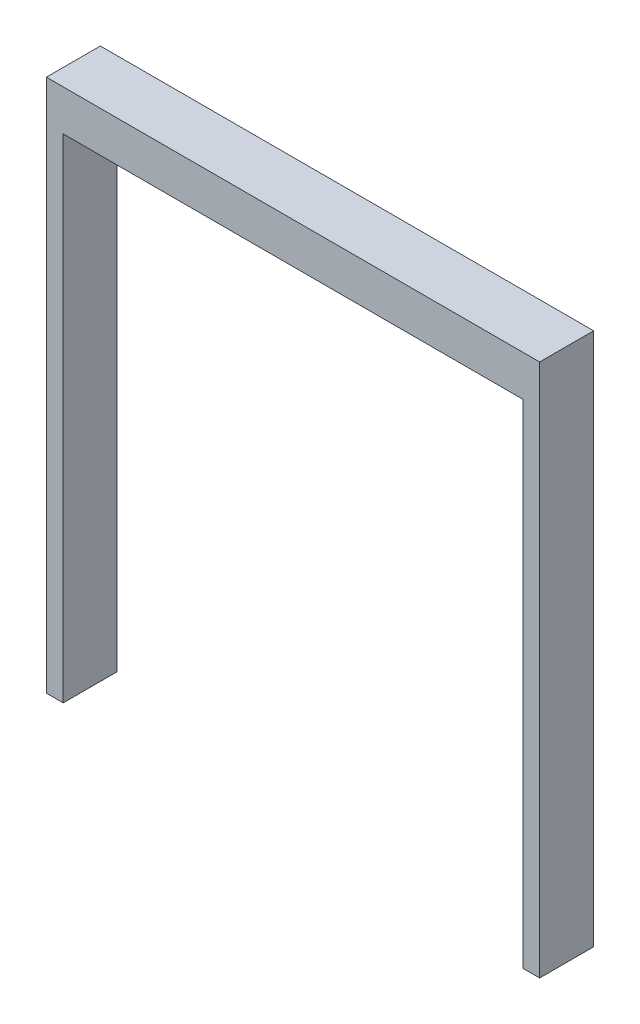
ISO-10303-21;
HEADER;
FILE_DESCRIPTION(('STEP AP214'),'2;1');
FILE_NAME('part.step','',(''),(''),'','','');
FILE_SCHEMA(('AUTOMOTIVE_DESIGN { 1 0 10303 214 1 1 1 1 }'));
ENDSEC;
DATA;
#1=APPLICATION_CONTEXT('core data for automotive mechanical design processes');
#2=APPLICATION_PROTOCOL_DEFINITION('international standard','automotive_design',2000,#1);
#3=PRODUCT_CONTEXT('',#1,'mechanical');
#4=PRODUCT('Part','Part','',(#3));
#5=PRODUCT_RELATED_PRODUCT_CATEGORY('part','',(#4));
#6=PRODUCT_DEFINITION_FORMATION('','',#4);
#7=PRODUCT_DEFINITION_CONTEXT('part definition',#1,'design');
#8=PRODUCT_DEFINITION('design','',#6,#7);
#9=PRODUCT_DEFINITION_SHAPE('','',#8);
#10=(LENGTH_UNIT() NAMED_UNIT(*) SI_UNIT(.MILLI.,.METRE.));
#11=(NAMED_UNIT(*) PLANE_ANGLE_UNIT() SI_UNIT($,.RADIAN.));
#12=(NAMED_UNIT(*) SI_UNIT($,.STERADIAN.) SOLID_ANGLE_UNIT());
#13=UNCERTAINTY_MEASURE_WITH_UNIT(LENGTH_MEASURE(1.E-05),#10,'distance_accuracy_value','');
#14=(GEOMETRIC_REPRESENTATION_CONTEXT(3) GLOBAL_UNCERTAINTY_ASSIGNED_CONTEXT((#13)) GLOBAL_UNIT_ASSIGNED_CONTEXT((#10,
#11,#12)) REPRESENTATION_CONTEXT('',''));
#15=CARTESIAN_POINT('',(0.,0.,0.));
#16=DIRECTION('',(0.,0.,1.));
#17=DIRECTION('',(1.,0.,0.));
#18=AXIS2_PLACEMENT_3D('',#15,#16,#17);
#19=CARTESIAN_POINT('',(-30.8578947368421,-25.7149122807017,5.3));
#20=DIRECTION('',(1.,0.,0.));
#21=DIRECTION('',(0.,0.,-1.));
#22=AXIS2_PLACEMENT_3D('',#19,#20,#21);
#23=PLANE('',#22);
#24=DIRECTION('',(0.,-1.,0.));
#25=VECTOR('',#24,1.);
#26=CARTESIAN_POINT('',(-30.8578947368421,-25.7149122807017,0.));
#27=LINE('',#26,#25);
#28=CARTESIAN_POINT('',(-30.8578947368421,26.6850877192983,0.));
#29=VERTEX_POINT('',#28);
#30=CARTESIAN_POINT('',(-30.8578947368421,-25.7149122807017,0.));
#31=VERTEX_POINT('',#30);
#32=EDGE_CURVE('E140',#29,#31,#27,.T.);
#33=ORIENTED_EDGE('',*,*,#32,.T.);
#34=DIRECTION('',(0.,0.,-1.));
#35=VECTOR('',#34,1.);
#36=CARTESIAN_POINT('',(-30.8578947368421,-25.7149122807017,5.3));
#37=LINE('',#36,#35);
#38=CARTESIAN_POINT('',(-30.8578947368421,-25.7149122807017,5.3));
#39=VERTEX_POINT('',#38);
#40=EDGE_CURVE('E11',#39,#31,#37,.T.);
#41=ORIENTED_EDGE('',*,*,#40,.F.);
#42=DIRECTION('',(0.,-1.,0.));
#43=VECTOR('',#42,1.);
#44=CARTESIAN_POINT('',(-30.8578947368421,-25.7149122807017,5.3));
#45=LINE('',#44,#43);
#46=CARTESIAN_POINT('',(-30.8578947368421,26.6850877192983,5.3));
#47=VERTEX_POINT('',#46);
#48=EDGE_CURVE('E162',#47,#39,#45,.T.);
#49=ORIENTED_EDGE('',*,*,#48,.F.);
#50=DIRECTION('',(0.,0.,-1.));
#51=VECTOR('',#50,1.);
#52=CARTESIAN_POINT('',(-30.8578947368421,26.6850877192983,5.3));
#53=LINE('',#52,#51);
#54=EDGE_CURVE('E136',#47,#29,#53,.T.);
#55=ORIENTED_EDGE('',*,*,#54,.T.);
#56=EDGE_LOOP('',(#33,#41,#49,#55));
#57=FACE_BOUND('',#56,.T.);
#58=ADVANCED_FACE('F39',(#57),#23,.F.);
#59=CARTESIAN_POINT('',(-29.2078947368421,-25.7149122807017,5.3));
#60=DIRECTION('',(0.,1.,0.));
#61=DIRECTION('',(0.,0.,1.));
#62=AXIS2_PLACEMENT_3D('',#59,#60,#61);
#63=PLANE('',#62);
#64=DIRECTION('',(1.,0.,0.));
#65=VECTOR('',#64,1.);
#66=CARTESIAN_POINT('',(-29.2078947368421,-25.7149122807017,0.));
#67=LINE('',#66,#65);
#68=CARTESIAN_POINT('',(-29.2078947368421,-25.7149122807017,0.));
#69=VERTEX_POINT('',#68);
#70=EDGE_CURVE('E144',#31,#69,#67,.T.);
#71=ORIENTED_EDGE('',*,*,#70,.T.);
#72=DIRECTION('',(0.,0.,-1.));
#73=VECTOR('',#72,1.);
#74=CARTESIAN_POINT('',(-29.2078947368421,-25.7149122807017,5.3));
#75=LINE('',#74,#73);
#76=CARTESIAN_POINT('',(-29.2078947368421,-25.7149122807017,5.3));
#77=VERTEX_POINT('',#76);
#78=EDGE_CURVE('E48',#77,#69,#75,.T.);
#79=ORIENTED_EDGE('',*,*,#78,.F.);
#80=DIRECTION('',(1.,0.,0.));
#81=VECTOR('',#80,1.);
#82=CARTESIAN_POINT('',(-29.2078947368421,-25.7149122807017,5.3));
#83=LINE('',#82,#81);
#84=EDGE_CURVE('E99',#39,#77,#83,.T.);
#85=ORIENTED_EDGE('',*,*,#84,.F.);
#86=ORIENTED_EDGE('',*,*,#40,.T.);
#87=EDGE_LOOP('',(#71,#79,#85,#86));
#88=FACE_BOUND('',#87,.T.);
#89=ADVANCED_FACE('F208',(#88),#63,.F.);
#90=CARTESIAN_POINT('',(-29.2078947368421,22.6850877192983,5.3));
#91=DIRECTION('',(-1.,0.,0.));
#92=DIRECTION('',(0.,-1.,0.));
#93=AXIS2_PLACEMENT_3D('',#90,#91,#92);
#94=PLANE('',#93);
#95=DIRECTION('',(0.,1.,0.));
#96=VECTOR('',#95,1.);
#97=CARTESIAN_POINT('',(-29.2078947368421,22.6850877192983,0.));
#98=LINE('',#97,#96);
#99=CARTESIAN_POINT('',(-29.2078947368421,22.6850877192983,0.));
#100=VERTEX_POINT('',#99);
#101=EDGE_CURVE('E147',#69,#100,#98,.T.);
#102=ORIENTED_EDGE('',*,*,#101,.T.);
#103=DIRECTION('',(0.,0.,-1.));
#104=VECTOR('',#103,1.);
#105=CARTESIAN_POINT('',(-29.2078947368421,22.6850877192983,5.3));
#106=LINE('',#105,#104);
#107=CARTESIAN_POINT('',(-29.2078947368421,22.6850877192983,5.3));
#108=VERTEX_POINT('',#107);
#109=EDGE_CURVE('E173',#108,#100,#106,.T.);
#110=ORIENTED_EDGE('',*,*,#109,.F.);
#111=DIRECTION('',(0.,1.,0.));
#112=VECTOR('',#111,1.);
#113=CARTESIAN_POINT('',(-29.2078947368421,22.6850877192983,5.3));
#114=LINE('',#113,#112);
#115=EDGE_CURVE('E183',#77,#108,#114,.T.);
#116=ORIENTED_EDGE('',*,*,#115,.F.);
#117=ORIENTED_EDGE('',*,*,#78,.T.);
#118=EDGE_LOOP('',(#102,#110,#116,#117));
#119=FACE_BOUND('',#118,.T.);
#120=ADVANCED_FACE('F181',(#119),#94,.F.);
#121=CARTESIAN_POINT('',(15.9421052631579,22.6850877192983,5.3));
#122=DIRECTION('',(0.,1.,0.));
#123=DIRECTION('',(-1.,0.,0.));
#124=AXIS2_PLACEMENT_3D('',#121,#122,#123);
#125=PLANE('',#124);
#126=DIRECTION('',(1.,0.,0.));
#127=VECTOR('',#126,1.);
#128=CARTESIAN_POINT('',(15.9421052631579,22.6850877192983,0.));
#129=LINE('',#128,#127);
#130=CARTESIAN_POINT('',(15.9421052631579,22.6850877192983,0.));
#131=VERTEX_POINT('',#130);
#132=EDGE_CURVE('E150',#100,#131,#129,.T.);
#133=ORIENTED_EDGE('',*,*,#132,.T.);
#134=DIRECTION('',(0.,0.,-1.));
#135=VECTOR('',#134,1.);
#136=CARTESIAN_POINT('',(15.9421052631579,22.6850877192983,5.3));
#137=LINE('',#136,#135);
#138=CARTESIAN_POINT('',(15.9421052631579,22.6850877192983,5.3));
#139=VERTEX_POINT('',#138);
#140=EDGE_CURVE('E169',#139,#131,#137,.T.);
#141=ORIENTED_EDGE('',*,*,#140,.F.);
#142=DIRECTION('',(1.,0.,0.));
#143=VECTOR('',#142,1.);
#144=CARTESIAN_POINT('',(15.9421052631579,22.6850877192983,5.3));
#145=LINE('',#144,#143);
#146=EDGE_CURVE('E196',#108,#139,#145,.T.);
#147=ORIENTED_EDGE('',*,*,#146,.F.);
#148=ORIENTED_EDGE('',*,*,#109,.T.);
#149=EDGE_LOOP('',(#133,#141,#147,#148));
#150=FACE_BOUND('',#149,.T.);
#151=ADVANCED_FACE('F191',(#150),#125,.F.);
#152=CARTESIAN_POINT('',(15.9421052631579,-25.7149122807017,5.3));
#153=DIRECTION('',(1.,0.,0.));
#154=DIRECTION('',(0.,1.,0.));
#155=AXIS2_PLACEMENT_3D('',#152,#153,#154);
#156=PLANE('',#155);
#157=DIRECTION('',(0.,-1.,0.));
#158=VECTOR('',#157,1.);
#159=CARTESIAN_POINT('',(15.9421052631579,-25.7149122807017,0.));
#160=LINE('',#159,#158);
#161=CARTESIAN_POINT('',(15.9421052631579,-25.7149122807017,0.));
#162=VERTEX_POINT('',#161);
#163=EDGE_CURVE('E153',#131,#162,#160,.T.);
#164=ORIENTED_EDGE('',*,*,#163,.T.);
#165=DIRECTION('',(0.,0.,-1.));
#166=VECTOR('',#165,1.);
#167=CARTESIAN_POINT('',(15.9421052631579,-25.7149122807017,5.3));
#168=LINE('',#167,#166);
#169=CARTESIAN_POINT('',(15.9421052631579,-25.7149122807017,5.3));
#170=VERTEX_POINT('',#169);
#171=EDGE_CURVE('E129',#170,#162,#168,.T.);
#172=ORIENTED_EDGE('',*,*,#171,.F.);
#173=DIRECTION('',(0.,-1.,0.));
#174=VECTOR('',#173,1.);
#175=CARTESIAN_POINT('',(15.9421052631579,-25.7149122807017,5.3));
#176=LINE('',#175,#174);
#177=EDGE_CURVE('E118',#139,#170,#176,.T.);
#178=ORIENTED_EDGE('',*,*,#177,.F.);
#179=ORIENTED_EDGE('',*,*,#140,.T.);
#180=EDGE_LOOP('',(#164,#172,#178,#179));
#181=FACE_BOUND('',#180,.T.);
#182=ADVANCED_FACE('F194',(#181),#156,.F.);
#183=CARTESIAN_POINT('',(17.5921052631579,-25.7149122807017,5.3));
#184=DIRECTION('',(0.,1.,0.));
#185=DIRECTION('',(0.,0.,1.));
#186=AXIS2_PLACEMENT_3D('',#183,#184,#185);
#187=PLANE('',#186);
#188=DIRECTION('',(1.,0.,0.));
#189=VECTOR('',#188,1.);
#190=CARTESIAN_POINT('',(17.5921052631579,-25.7149122807017,0.));
#191=LINE('',#190,#189);
#192=CARTESIAN_POINT('',(17.5921052631579,-25.7149122807017,0.));
#193=VERTEX_POINT('',#192);
#194=EDGE_CURVE('E127',#162,#193,#191,.T.);
#195=ORIENTED_EDGE('',*,*,#194,.T.);
#196=DIRECTION('',(0.,0.,-1.));
#197=VECTOR('',#196,1.);
#198=CARTESIAN_POINT('',(17.5921052631579,-25.7149122807017,5.3));
#199=LINE('',#198,#197);
#200=CARTESIAN_POINT('',(17.5921052631579,-25.7149122807017,5.3));
#201=VERTEX_POINT('',#200);
#202=EDGE_CURVE('E124',#201,#193,#199,.T.);
#203=ORIENTED_EDGE('',*,*,#202,.F.);
#204=DIRECTION('',(1.,0.,0.));
#205=VECTOR('',#204,1.);
#206=CARTESIAN_POINT('',(17.5921052631579,-25.7149122807017,5.3));
#207=LINE('',#206,#205);
#208=EDGE_CURVE('E112',#170,#201,#207,.T.);
#209=ORIENTED_EDGE('',*,*,#208,.F.);
#210=ORIENTED_EDGE('',*,*,#171,.T.);
#211=EDGE_LOOP('',(#195,#203,#209,#210));
#212=FACE_BOUND('',#211,.T.);
#213=ADVANCED_FACE('F125',(#212),#187,.F.);
#214=CARTESIAN_POINT('',(17.5921052631579,26.6850877192983,5.3));
#215=DIRECTION('',(-1.,0.,0.));
#216=DIRECTION('',(0.,-1.,0.));
#217=AXIS2_PLACEMENT_3D('',#214,#215,#216);
#218=PLANE('',#217);
#219=DIRECTION('',(0.,1.,0.));
#220=VECTOR('',#219,1.);
#221=CARTESIAN_POINT('',(17.5921052631579,26.6850877192983,0.));
#222=LINE('',#221,#220);
#223=CARTESIAN_POINT('',(17.5921052631579,26.6850877192983,0.));
#224=VERTEX_POINT('',#223);
#225=EDGE_CURVE('E85',#193,#224,#222,.T.);
#226=ORIENTED_EDGE('',*,*,#225,.T.);
#227=DIRECTION('',(0.,0.,-1.));
#228=VECTOR('',#227,1.);
#229=CARTESIAN_POINT('',(17.5921052631579,26.6850877192983,5.3));
#230=LINE('',#229,#228);
#231=CARTESIAN_POINT('',(17.5921052631579,26.6850877192983,5.3));
#232=VERTEX_POINT('',#231);
#233=EDGE_CURVE('E130',#232,#224,#230,.T.);
#234=ORIENTED_EDGE('',*,*,#233,.F.);
#235=DIRECTION('',(0.,1.,0.));
#236=VECTOR('',#235,1.);
#237=CARTESIAN_POINT('',(17.5921052631579,26.6850877192983,5.3));
#238=LINE('',#237,#236);
#239=EDGE_CURVE('E116',#201,#232,#238,.T.);
#240=ORIENTED_EDGE('',*,*,#239,.F.);
#241=ORIENTED_EDGE('',*,*,#202,.T.);
#242=EDGE_LOOP('',(#226,#234,#240,#241));
#243=FACE_BOUND('',#242,.T.);
#244=ADVANCED_FACE('F132',(#243),#218,.F.);
#245=CARTESIAN_POINT('',(-30.8578947368421,26.6850877192983,5.3));
#246=DIRECTION('',(0.,-1.,0.));
#247=DIRECTION('',(0.,0.,-1.));
#248=AXIS2_PLACEMENT_3D('',#245,#246,#247);
#249=PLANE('',#248);
#250=DIRECTION('',(-1.,0.,0.));
#251=VECTOR('',#250,1.);
#252=CARTESIAN_POINT('',(-30.8578947368421,26.6850877192983,0.));
#253=LINE('',#252,#251);
#254=EDGE_CURVE('E91',#224,#29,#253,.T.);
#255=ORIENTED_EDGE('',*,*,#254,.T.);
#256=ORIENTED_EDGE('',*,*,#54,.F.);
#257=DIRECTION('',(-1.,0.,0.));
#258=VECTOR('',#257,1.);
#259=CARTESIAN_POINT('',(-30.8578947368421,26.6850877192983,5.3));
#260=LINE('',#259,#258);
#261=EDGE_CURVE('E56',#232,#47,#260,.T.);
#262=ORIENTED_EDGE('',*,*,#261,.F.);
#263=ORIENTED_EDGE('',*,*,#233,.T.);
#264=EDGE_LOOP('',(#255,#256,#262,#263));
#265=FACE_BOUND('',#264,.T.);
#266=ADVANCED_FACE('F224',(#265),#249,.F.);
#267=CARTESIAN_POINT('',(0.,0.,5.3));
#268=DIRECTION('',(0.,0.,-1.));
#269=DIRECTION('',(-1.,0.,0.));
#270=AXIS2_PLACEMENT_3D('',#267,#268,#269);
#271=PLANE('',#270);
#272=ORIENTED_EDGE('',*,*,#48,.T.);
#273=ORIENTED_EDGE('',*,*,#84,.T.);
#274=ORIENTED_EDGE('',*,*,#115,.T.);
#275=ORIENTED_EDGE('',*,*,#146,.T.);
#276=ORIENTED_EDGE('',*,*,#177,.T.);
#277=ORIENTED_EDGE('',*,*,#208,.T.);
#278=ORIENTED_EDGE('',*,*,#239,.T.);
#279=ORIENTED_EDGE('',*,*,#261,.T.);
#280=EDGE_LOOP('',(#272,#273,#274,#275,#276,#277,#278,#279));
#281=FACE_BOUND('',#280,.T.);
#282=ADVANCED_FACE('F114',(#281),#271,.F.);
#283=CARTESIAN_POINT('',(0.,0.,0.));
#284=DIRECTION('',(0.,0.,-1.));
#285=DIRECTION('',(-1.,0.,0.));
#286=AXIS2_PLACEMENT_3D('',#283,#284,#285);
#287=PLANE('',#286);
#288=ORIENTED_EDGE('',*,*,#32,.F.);
#289=ORIENTED_EDGE('',*,*,#254,.F.);
#290=ORIENTED_EDGE('',*,*,#225,.F.);
#291=ORIENTED_EDGE('',*,*,#194,.F.);
#292=ORIENTED_EDGE('',*,*,#163,.F.);
#293=ORIENTED_EDGE('',*,*,#132,.F.);
#294=ORIENTED_EDGE('',*,*,#101,.F.);
#295=ORIENTED_EDGE('',*,*,#70,.F.);
#296=EDGE_LOOP('',(#288,#289,#290,#291,#292,#293,#294,#295));
#297=FACE_BOUND('',#296,.T.);
#298=ADVANCED_FACE('F187',(#297),#287,.T.);
#299=CLOSED_SHELL('',(#58,#89,#120,#151,#182,#213,#244,#266,#282,#298));
#300=MANIFOLD_SOLID_BREP('B2',#299);
#301=ADVANCED_BREP_SHAPE_REPRESENTATION('',(#18,#300),#14);
#302=SHAPE_DEFINITION_REPRESENTATION(#9,#301);
ENDSEC;
END-ISO-10303-21;
